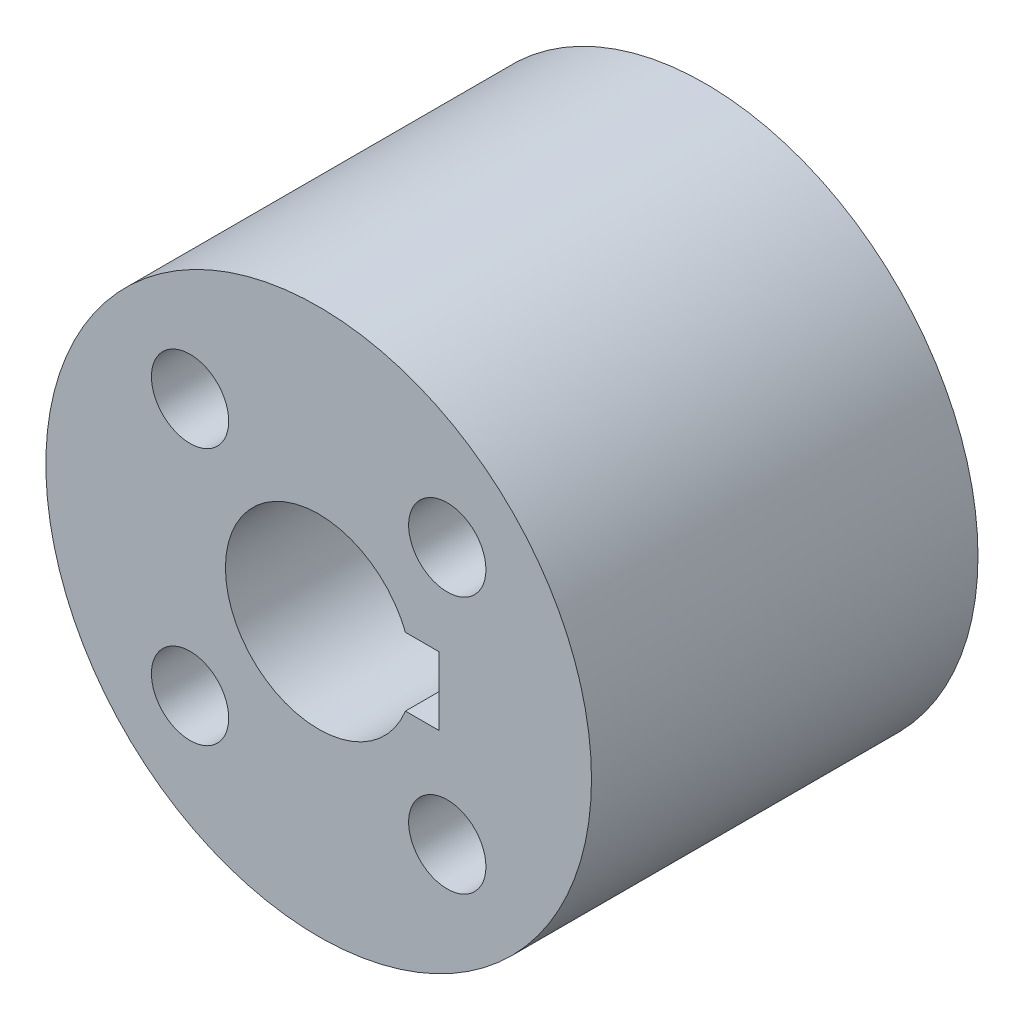
ISO-10303-21;
HEADER;
FILE_DESCRIPTION(('STEP AP214'),'2;1');
FILE_NAME('part.step','',(''),(''),'','','');
FILE_SCHEMA(('AUTOMOTIVE_DESIGN { 1 0 10303 214 1 1 1 1 }'));
ENDSEC;
DATA;
#1=APPLICATION_CONTEXT('core data for automotive mechanical design processes');
#2=APPLICATION_PROTOCOL_DEFINITION('international standard','automotive_design',2000,#1);
#3=PRODUCT_CONTEXT('',#1,'mechanical');
#4=PRODUCT('Part','Part','',(#3));
#5=PRODUCT_RELATED_PRODUCT_CATEGORY('part','',(#4));
#6=PRODUCT_DEFINITION_FORMATION('','',#4);
#7=PRODUCT_DEFINITION_CONTEXT('part definition',#1,'design');
#8=PRODUCT_DEFINITION('design','',#6,#7);
#9=PRODUCT_DEFINITION_SHAPE('','',#8);
#10=(LENGTH_UNIT() NAMED_UNIT(*) SI_UNIT(.MILLI.,.METRE.));
#11=(NAMED_UNIT(*) PLANE_ANGLE_UNIT() SI_UNIT($,.RADIAN.));
#12=(NAMED_UNIT(*) SI_UNIT($,.STERADIAN.) SOLID_ANGLE_UNIT());
#13=UNCERTAINTY_MEASURE_WITH_UNIT(LENGTH_MEASURE(1.E-05),#10,'distance_accuracy_value','');
#14=(GEOMETRIC_REPRESENTATION_CONTEXT(3) GLOBAL_UNCERTAINTY_ASSIGNED_CONTEXT((#13)) GLOBAL_UNIT_ASSIGNED_CONTEXT((#10,
#11,#12)) REPRESENTATION_CONTEXT('',''));
#15=CARTESIAN_POINT('',(0.,0.,0.));
#16=DIRECTION('',(0.,0.,1.));
#17=DIRECTION('',(1.,0.,0.));
#18=AXIS2_PLACEMENT_3D('',#15,#16,#17);
#19=CARTESIAN_POINT('',(5.65685424949237,-5.65685424949239,17.));
#20=DIRECTION('',(0.,0.,-1.));
#21=DIRECTION('',(-1.,0.,0.));
#22=AXIS2_PLACEMENT_3D('',#19,#20,#21);
#23=CYLINDRICAL_SURFACE('',#22,1.7);
#24=CARTESIAN_POINT('',(5.65685424949237,-5.65685424949239,12.));
#25=DIRECTION('',(0.,0.,1.));
#26=DIRECTION('',(1.,0.,0.));
#27=AXIS2_PLACEMENT_3D('',#24,#25,#26);
#28=CIRCLE('',#27,1.7);
#29=CARTESIAN_POINT('',(7.35685424949237,-5.65685424949239,12.));
#30=VERTEX_POINT('',#29);
#31=EDGE_CURVE('E182',#30,#30,#28,.T.);
#32=ORIENTED_EDGE('',*,*,#31,.F.);
#33=EDGE_LOOP('',(#32));
#34=FACE_BOUND('',#33,.T.);
#35=CARTESIAN_POINT('',(5.65685424949237,-5.65685424949239,17.));
#36=DIRECTION('',(0.,0.,1.));
#37=DIRECTION('',(1.,0.,0.));
#38=AXIS2_PLACEMENT_3D('',#35,#36,#37);
#39=CIRCLE('',#38,1.7);
#40=CARTESIAN_POINT('',(7.35685424949237,-5.65685424949239,17.));
#41=VERTEX_POINT('',#40);
#42=EDGE_CURVE('E282',#41,#41,#39,.T.);
#43=ORIENTED_EDGE('',*,*,#42,.T.);
#44=EDGE_LOOP('',(#43));
#45=FACE_BOUND('',#44,.T.);
#46=ADVANCED_FACE('F178',(#34,#45),#23,.F.);
#47=CARTESIAN_POINT('',(0.,0.,0.));
#48=DIRECTION('',(0.,0.,1.));
#49=DIRECTION('',(1.,0.,0.));
#50=AXIS2_PLACEMENT_3D('',#47,#48,#49);
#51=PLANE('',#50);
#52=CARTESIAN_POINT('',(5.65685424949245,-5.65685424949231,0.));
#53=DIRECTION('',(0.,0.,-1.));
#54=DIRECTION('',(-1.,0.,0.));
#55=AXIS2_PLACEMENT_3D('',#52,#53,#54);
#56=CIRCLE('',#55,3.5);
#57=CARTESIAN_POINT('',(2.15685424949245,-5.65685424949231,0.));
#58=VERTEX_POINT('',#57);
#59=EDGE_CURVE('E368',#58,#58,#56,.T.);
#60=ORIENTED_EDGE('',*,*,#59,.F.);
#61=EDGE_LOOP('',(#60));
#62=FACE_BOUND('',#61,.T.);
#63=CARTESIAN_POINT('',(-5.65685424949233,-5.65685424949243,0.));
#64=DIRECTION('',(0.,0.,-1.));
#65=DIRECTION('',(-1.,0.,0.));
#66=AXIS2_PLACEMENT_3D('',#63,#64,#65);
#67=CIRCLE('',#66,3.5);
#68=CARTESIAN_POINT('',(-9.15685424949233,-5.65685424949243,0.));
#69=VERTEX_POINT('',#68);
#70=EDGE_CURVE('E358',#69,#69,#67,.T.);
#71=ORIENTED_EDGE('',*,*,#70,.F.);
#72=EDGE_LOOP('',(#71));
#73=FACE_BOUND('',#72,.T.);
#74=CARTESIAN_POINT('',(-5.65685424949241,5.65685424949235,0.));
#75=DIRECTION('',(0.,0.,-1.));
#76=DIRECTION('',(-1.,0.,0.));
#77=AXIS2_PLACEMENT_3D('',#74,#75,#76);
#78=CIRCLE('',#77,3.5);
#79=CARTESIAN_POINT('',(-9.15685424949241,5.65685424949235,0.));
#80=VERTEX_POINT('',#79);
#81=EDGE_CURVE('E357',#80,#80,#78,.T.);
#82=ORIENTED_EDGE('',*,*,#81,.F.);
#83=EDGE_LOOP('',(#82));
#84=FACE_BOUND('',#83,.T.);
#85=CARTESIAN_POINT('',(5.65685424949237,5.65685424949239,0.));
#86=DIRECTION('',(0.,0.,-1.));
#87=DIRECTION('',(-1.,0.,0.));
#88=AXIS2_PLACEMENT_3D('',#85,#86,#87);
#89=CIRCLE('',#88,3.5);
#90=CARTESIAN_POINT('',(2.15685424949237,5.65685424949239,0.));
#91=VERTEX_POINT('',#90);
#92=EDGE_CURVE('E361',#91,#91,#89,.T.);
#93=ORIENTED_EDGE('',*,*,#92,.F.);
#94=EDGE_LOOP('',(#93));
#95=FACE_BOUND('',#94,.T.);
#96=CARTESIAN_POINT('',(0.,0.,0.));
#97=DIRECTION('',(0.,0.,1.));
#98=DIRECTION('',(1.,0.,0.));
#99=AXIS2_PLACEMENT_3D('',#96,#97,#98);
#100=CIRCLE('',#99,12.);
#101=CARTESIAN_POINT('',(12.,0.,0.));
#102=VERTEX_POINT('',#101);
#103=EDGE_CURVE('E245',#102,#102,#100,.T.);
#104=ORIENTED_EDGE('',*,*,#103,.F.);
#105=EDGE_LOOP('',(#104));
#106=FACE_BOUND('',#105,.T.);
#107=CARTESIAN_POINT('',(0.,0.,0.));
#108=DIRECTION('',(0.,0.,1.));
#109=DIRECTION('',(1.,0.,0.));
#110=AXIS2_PLACEMENT_3D('',#107,#108,#109);
#111=CIRCLE('',#110,4.1);
#112=CARTESIAN_POINT('',(3.81575680566778,1.5,0.));
#113=VERTEX_POINT('',#112);
#114=CARTESIAN_POINT('',(3.81575680566778,-1.5,0.));
#115=VERTEX_POINT('',#114);
#116=EDGE_CURVE('E248',#113,#115,#111,.T.);
#117=ORIENTED_EDGE('',*,*,#116,.T.);
#118=DIRECTION('',(1.,0.,0.));
#119=VECTOR('',#118,1.);
#120=CARTESIAN_POINT('',(0.,-1.5,0.));
#121=LINE('',#120,#119);
#122=CARTESIAN_POINT('',(5.3,-1.5,0.));
#123=VERTEX_POINT('',#122);
#124=EDGE_CURVE('E253',#115,#123,#121,.T.);
#125=ORIENTED_EDGE('',*,*,#124,.T.);
#126=DIRECTION('',(0.,1.,0.));
#127=VECTOR('',#126,1.);
#128=CARTESIAN_POINT('',(5.3,0.,0.));
#129=LINE('',#128,#127);
#130=CARTESIAN_POINT('',(5.3,1.5,0.));
#131=VERTEX_POINT('',#130);
#132=EDGE_CURVE('E251',#123,#131,#129,.T.);
#133=ORIENTED_EDGE('',*,*,#132,.T.);
#134=DIRECTION('',(1.,0.,0.));
#135=VECTOR('',#134,1.);
#136=CARTESIAN_POINT('',(0.,1.5,0.));
#137=LINE('',#136,#135);
#138=EDGE_CURVE('E235',#113,#131,#137,.T.);
#139=ORIENTED_EDGE('',*,*,#138,.F.);
#140=EDGE_LOOP('',(#117,#125,#133,#139));
#141=FACE_BOUND('',#140,.T.);
#142=ADVANCED_FACE('F277',(#62,#73,#84,#95,#106,#141),#51,.F.);
#143=CARTESIAN_POINT('',(-5.65685424949241,-5.65685424949235,17.));
#144=DIRECTION('',(0.,0.,-1.));
#145=DIRECTION('',(-1.,0.,0.));
#146=AXIS2_PLACEMENT_3D('',#143,#144,#145);
#147=CYLINDRICAL_SURFACE('',#146,1.7);
#148=CARTESIAN_POINT('',(-5.65685424949241,-5.65685424949235,12.));
#149=DIRECTION('',(0.,0.,1.));
#150=DIRECTION('',(1.,0.,0.));
#151=AXIS2_PLACEMENT_3D('',#148,#149,#150);
#152=CIRCLE('',#151,1.7);
#153=CARTESIAN_POINT('',(-3.95685424949241,-5.65685424949235,12.));
#154=VERTEX_POINT('',#153);
#155=EDGE_CURVE('E265',#154,#154,#152,.T.);
#156=ORIENTED_EDGE('',*,*,#155,.F.);
#157=EDGE_LOOP('',(#156));
#158=FACE_BOUND('',#157,.T.);
#159=CARTESIAN_POINT('',(-5.65685424949241,-5.65685424949235,17.));
#160=DIRECTION('',(0.,0.,1.));
#161=DIRECTION('',(1.,0.,0.));
#162=AXIS2_PLACEMENT_3D('',#159,#160,#161);
#163=CIRCLE('',#162,1.7);
#164=CARTESIAN_POINT('',(-3.95685424949241,-5.65685424949235,17.));
#165=VERTEX_POINT('',#164);
#166=EDGE_CURVE('E284',#165,#165,#163,.T.);
#167=ORIENTED_EDGE('',*,*,#166,.T.);
#168=EDGE_LOOP('',(#167));
#169=FACE_BOUND('',#168,.T.);
#170=ADVANCED_FACE('F279',(#158,#169),#147,.F.);
#171=CARTESIAN_POINT('',(-5.65685424949233,5.65685424949243,17.));
#172=DIRECTION('',(0.,0.,-1.));
#173=DIRECTION('',(-1.,0.,0.));
#174=AXIS2_PLACEMENT_3D('',#171,#172,#173);
#175=CYLINDRICAL_SURFACE('',#174,1.7);
#176=CARTESIAN_POINT('',(-5.65685424949233,5.65685424949243,12.));
#177=DIRECTION('',(0.,0.,1.));
#178=DIRECTION('',(1.,0.,0.));
#179=AXIS2_PLACEMENT_3D('',#176,#177,#178);
#180=CIRCLE('',#179,1.7);
#181=CARTESIAN_POINT('',(-3.95685424949233,5.65685424949243,12.));
#182=VERTEX_POINT('',#181);
#183=EDGE_CURVE('E262',#182,#182,#180,.T.);
#184=ORIENTED_EDGE('',*,*,#183,.F.);
#185=EDGE_LOOP('',(#184));
#186=FACE_BOUND('',#185,.T.);
#187=CARTESIAN_POINT('',(-5.65685424949233,5.65685424949243,17.));
#188=DIRECTION('',(0.,0.,1.));
#189=DIRECTION('',(1.,0.,0.));
#190=AXIS2_PLACEMENT_3D('',#187,#188,#189);
#191=CIRCLE('',#190,1.7);
#192=CARTESIAN_POINT('',(-3.95685424949233,5.65685424949243,17.));
#193=VERTEX_POINT('',#192);
#194=EDGE_CURVE('E256',#193,#193,#191,.T.);
#195=ORIENTED_EDGE('',*,*,#194,.T.);
#196=EDGE_LOOP('',(#195));
#197=FACE_BOUND('',#196,.T.);
#198=ADVANCED_FACE('F180',(#186,#197),#175,.F.);
#199=CARTESIAN_POINT('',(5.65685424949237,5.65685424949239,17.));
#200=DIRECTION('',(0.,0.,-1.));
#201=DIRECTION('',(-1.,0.,0.));
#202=AXIS2_PLACEMENT_3D('',#199,#200,#201);
#203=CYLINDRICAL_SURFACE('',#202,1.7);
#204=CARTESIAN_POINT('',(5.65685424949237,5.65685424949239,12.));
#205=DIRECTION('',(0.,0.,1.));
#206=DIRECTION('',(1.,0.,0.));
#207=AXIS2_PLACEMENT_3D('',#204,#205,#206);
#208=CIRCLE('',#207,1.7);
#209=CARTESIAN_POINT('',(7.35685424949237,5.65685424949239,12.));
#210=VERTEX_POINT('',#209);
#211=EDGE_CURVE('E259',#210,#210,#208,.T.);
#212=ORIENTED_EDGE('',*,*,#211,.F.);
#213=EDGE_LOOP('',(#212));
#214=FACE_BOUND('',#213,.T.);
#215=CARTESIAN_POINT('',(5.65685424949237,5.65685424949239,17.));
#216=DIRECTION('',(0.,0.,1.));
#217=DIRECTION('',(1.,0.,0.));
#218=AXIS2_PLACEMENT_3D('',#215,#216,#217);
#219=CIRCLE('',#218,1.7);
#220=CARTESIAN_POINT('',(7.35685424949237,5.65685424949239,17.));
#221=VERTEX_POINT('',#220);
#222=EDGE_CURVE('E285',#221,#221,#219,.T.);
#223=ORIENTED_EDGE('',*,*,#222,.T.);
#224=EDGE_LOOP('',(#223));
#225=FACE_BOUND('',#224,.T.);
#226=ADVANCED_FACE('F304',(#214,#225),#203,.F.);
#227=CARTESIAN_POINT('',(5.3,0.,17.));
#228=DIRECTION('',(-1.,0.,0.));
#229=DIRECTION('',(0.,0.,1.));
#230=AXIS2_PLACEMENT_3D('',#227,#228,#229);
#231=PLANE('',#230);
#232=ORIENTED_EDGE('',*,*,#132,.F.);
#233=DIRECTION('',(0.,0.,-1.));
#234=VECTOR('',#233,1.);
#235=CARTESIAN_POINT('',(5.3,-1.5,17.));
#236=LINE('',#235,#234);
#237=CARTESIAN_POINT('',(5.3,-1.5,17.));
#238=VERTEX_POINT('',#237);
#239=EDGE_CURVE('E210',#238,#123,#236,.T.);
#240=ORIENTED_EDGE('',*,*,#239,.F.);
#241=DIRECTION('',(0.,1.,0.));
#242=VECTOR('',#241,1.);
#243=CARTESIAN_POINT('',(5.3,0.,17.));
#244=LINE('',#243,#242);
#245=CARTESIAN_POINT('',(5.3,1.5,17.));
#246=VERTEX_POINT('',#245);
#247=EDGE_CURVE('E228',#238,#246,#244,.T.);
#248=ORIENTED_EDGE('',*,*,#247,.T.);
#249=DIRECTION('',(0.,0.,-1.));
#250=VECTOR('',#249,1.);
#251=CARTESIAN_POINT('',(5.3,1.5,17.));
#252=LINE('',#251,#250);
#253=EDGE_CURVE('E188',#246,#131,#252,.T.);
#254=ORIENTED_EDGE('',*,*,#253,.T.);
#255=EDGE_LOOP('',(#232,#240,#248,#254));
#256=FACE_BOUND('',#255,.T.);
#257=ADVANCED_FACE('F239',(#256),#231,.T.);
#258=CARTESIAN_POINT('',(0.,-1.5,17.));
#259=DIRECTION('',(0.,1.,0.));
#260=DIRECTION('',(0.,0.,1.));
#261=AXIS2_PLACEMENT_3D('',#258,#259,#260);
#262=PLANE('',#261);
#263=ORIENTED_EDGE('',*,*,#124,.F.);
#264=DIRECTION('',(0.,0.,-1.));
#265=VECTOR('',#264,1.);
#266=CARTESIAN_POINT('',(3.81575680566778,-1.5,17.));
#267=LINE('',#266,#265);
#268=CARTESIAN_POINT('',(3.81575680566778,-1.5,17.));
#269=VERTEX_POINT('',#268);
#270=EDGE_CURVE('E197',#269,#115,#267,.T.);
#271=ORIENTED_EDGE('',*,*,#270,.F.);
#272=DIRECTION('',(1.,0.,0.));
#273=VECTOR('',#272,1.);
#274=CARTESIAN_POINT('',(0.,-1.5,17.));
#275=LINE('',#274,#273);
#276=EDGE_CURVE('E240',#269,#238,#275,.T.);
#277=ORIENTED_EDGE('',*,*,#276,.T.);
#278=ORIENTED_EDGE('',*,*,#239,.T.);
#279=EDGE_LOOP('',(#263,#271,#277,#278));
#280=FACE_BOUND('',#279,.T.);
#281=ADVANCED_FACE('F296',(#280),#262,.T.);
#282=CARTESIAN_POINT('',(0.,1.5,17.));
#283=DIRECTION('',(0.,1.,0.));
#284=DIRECTION('',(0.,0.,1.));
#285=AXIS2_PLACEMENT_3D('',#282,#283,#284);
#286=PLANE('',#285);
#287=ORIENTED_EDGE('',*,*,#138,.T.);
#288=ORIENTED_EDGE('',*,*,#253,.F.);
#289=DIRECTION('',(1.,0.,0.));
#290=VECTOR('',#289,1.);
#291=CARTESIAN_POINT('',(0.,1.5,17.));
#292=LINE('',#291,#290);
#293=CARTESIAN_POINT('',(3.81575680566778,1.5,17.));
#294=VERTEX_POINT('',#293);
#295=EDGE_CURVE('E223',#294,#246,#292,.T.);
#296=ORIENTED_EDGE('',*,*,#295,.F.);
#297=DIRECTION('',(0.,0.,-1.));
#298=VECTOR('',#297,1.);
#299=CARTESIAN_POINT('',(3.81575680566778,1.5,17.));
#300=LINE('',#299,#298);
#301=EDGE_CURVE('E13',#294,#113,#300,.T.);
#302=ORIENTED_EDGE('',*,*,#301,.T.);
#303=EDGE_LOOP('',(#287,#288,#296,#302));
#304=FACE_BOUND('',#303,.T.);
#305=ADVANCED_FACE('F233',(#304),#286,.F.);
#306=CARTESIAN_POINT('',(0.,0.,17.));
#307=DIRECTION('',(0.,0.,-1.));
#308=DIRECTION('',(-1.,0.,0.));
#309=AXIS2_PLACEMENT_3D('',#306,#307,#308);
#310=CYLINDRICAL_SURFACE('',#309,4.1);
#311=ORIENTED_EDGE('',*,*,#116,.F.);
#312=ORIENTED_EDGE('',*,*,#301,.F.);
#313=CARTESIAN_POINT('',(0.,0.,17.));
#314=DIRECTION('',(0.,0.,1.));
#315=DIRECTION('',(1.,0.,0.));
#316=AXIS2_PLACEMENT_3D('',#313,#314,#315);
#317=CIRCLE('',#316,4.1);
#318=EDGE_CURVE('E229',#294,#269,#317,.T.);
#319=ORIENTED_EDGE('',*,*,#318,.T.);
#320=ORIENTED_EDGE('',*,*,#270,.T.);
#321=EDGE_LOOP('',(#311,#312,#319,#320));
#322=FACE_BOUND('',#321,.T.);
#323=ADVANCED_FACE('F295',(#322),#310,.F.);
#324=CARTESIAN_POINT('',(0.,0.,17.));
#325=DIRECTION('',(0.,0.,-1.));
#326=DIRECTION('',(-1.,0.,0.));
#327=AXIS2_PLACEMENT_3D('',#324,#325,#326);
#328=CYLINDRICAL_SURFACE('',#327,12.);
#329=CARTESIAN_POINT('',(0.,0.,17.));
#330=DIRECTION('',(0.,0.,1.));
#331=DIRECTION('',(1.,0.,0.));
#332=AXIS2_PLACEMENT_3D('',#329,#330,#331);
#333=CIRCLE('',#332,12.);
#334=CARTESIAN_POINT('',(12.,0.,17.));
#335=VERTEX_POINT('',#334);
#336=EDGE_CURVE('E288',#335,#335,#333,.T.);
#337=ORIENTED_EDGE('',*,*,#336,.F.);
#338=EDGE_LOOP('',(#337));
#339=FACE_BOUND('',#338,.T.);
#340=ORIENTED_EDGE('',*,*,#103,.T.);
#341=EDGE_LOOP('',(#340));
#342=FACE_BOUND('',#341,.T.);
#343=ADVANCED_FACE('F320',(#339,#342),#328,.T.);
#344=CARTESIAN_POINT('',(0.,0.,17.));
#345=DIRECTION('',(0.,0.,1.));
#346=DIRECTION('',(1.,0.,0.));
#347=AXIS2_PLACEMENT_3D('',#344,#345,#346);
#348=PLANE('',#347);
#349=ORIENTED_EDGE('',*,*,#194,.F.);
#350=EDGE_LOOP('',(#349));
#351=FACE_BOUND('',#350,.T.);
#352=ORIENTED_EDGE('',*,*,#222,.F.);
#353=EDGE_LOOP('',(#352));
#354=FACE_BOUND('',#353,.T.);
#355=ORIENTED_EDGE('',*,*,#42,.F.);
#356=EDGE_LOOP('',(#355));
#357=FACE_BOUND('',#356,.T.);
#358=ORIENTED_EDGE('',*,*,#166,.F.);
#359=EDGE_LOOP('',(#358));
#360=FACE_BOUND('',#359,.T.);
#361=ORIENTED_EDGE('',*,*,#336,.T.);
#362=EDGE_LOOP('',(#361));
#363=FACE_BOUND('',#362,.T.);
#364=ORIENTED_EDGE('',*,*,#318,.F.);
#365=ORIENTED_EDGE('',*,*,#295,.T.);
#366=ORIENTED_EDGE('',*,*,#247,.F.);
#367=ORIENTED_EDGE('',*,*,#276,.F.);
#368=EDGE_LOOP('',(#364,#365,#366,#367));
#369=FACE_BOUND('',#368,.T.);
#370=ADVANCED_FACE('F225',(#351,#354,#357,#360,#363,#369),#348,.T.);
#371=CARTESIAN_POINT('',(0.,0.,12.));
#372=DIRECTION('',(0.,0.,1.));
#373=DIRECTION('',(1.,0.,0.));
#374=AXIS2_PLACEMENT_3D('',#371,#372,#373);
#375=PLANE('',#374);
#376=ORIENTED_EDGE('',*,*,#211,.T.);
#377=EDGE_LOOP('',(#376));
#378=FACE_BOUND('',#377,.T.);
#379=CARTESIAN_POINT('',(5.65685424949237,5.65685424949239,12.));
#380=DIRECTION('',(0.,0.,1.));
#381=DIRECTION('',(1.,0.,0.));
#382=AXIS2_PLACEMENT_3D('',#379,#380,#381);
#383=CIRCLE('',#382,3.5);
#384=CARTESIAN_POINT('',(2.15685424949237,5.65685424949239,12.));
#385=VERTEX_POINT('',#384);
#386=EDGE_CURVE('E263',#385,#385,#383,.F.);
#387=ORIENTED_EDGE('',*,*,#386,.T.);
#388=EDGE_LOOP('',(#387));
#389=FACE_BOUND('',#388,.T.);
#390=ADVANCED_FACE('F319',(#378,#389),#375,.F.);
#391=CARTESIAN_POINT('',(5.65685424949237,5.65685424949239,26.8994949366117));
#392=DIRECTION('',(0.,0.,-1.));
#393=DIRECTION('',(-1.,0.,0.));
#394=AXIS2_PLACEMENT_3D('',#391,#392,#393);
#395=CYLINDRICAL_SURFACE('',#394,3.5);
#396=CARTESIAN_POINT('',(2.15685424949237,5.65685424949239,0.));
#397=CARTESIAN_POINT('',(2.15685424949237,5.65685424949239,0.125000000000004));
#398=CARTESIAN_POINT('',(2.15685424949237,5.65685424949239,0.250000000000004));
#399=CARTESIAN_POINT('',(2.15685424949237,5.65685424949239,0.500000000000004));
#400=CARTESIAN_POINT('',(2.15685424949237,5.65685424949239,0.625000000000004));
#401=CARTESIAN_POINT('',(2.15685424949237,5.65685424949239,0.875000000000004));
#402=CARTESIAN_POINT('',(2.15685424949237,5.65685424949239,1.));
#403=CARTESIAN_POINT('',(2.15685424949237,5.65685424949239,1.25));
#404=CARTESIAN_POINT('',(2.15685424949237,5.65685424949239,1.375));
#405=CARTESIAN_POINT('',(2.15685424949237,5.65685424949239,1.625));
#406=CARTESIAN_POINT('',(2.15685424949237,5.65685424949239,1.75));
#407=CARTESIAN_POINT('',(2.15685424949237,5.65685424949239,2.));
#408=CARTESIAN_POINT('',(2.15685424949237,5.65685424949239,2.125));
#409=CARTESIAN_POINT('',(2.15685424949237,5.65685424949239,2.375));
#410=CARTESIAN_POINT('',(2.15685424949237,5.65685424949239,2.5));
#411=CARTESIAN_POINT('',(2.15685424949237,5.65685424949239,2.75));
#412=CARTESIAN_POINT('',(2.15685424949237,5.65685424949239,2.875));
#413=CARTESIAN_POINT('',(2.15685424949237,5.65685424949239,3.125));
#414=CARTESIAN_POINT('',(2.15685424949237,5.65685424949239,3.25));
#415=CARTESIAN_POINT('',(2.15685424949237,5.65685424949239,3.5));
#416=CARTESIAN_POINT('',(2.15685424949237,5.65685424949239,3.625));
#417=CARTESIAN_POINT('',(2.15685424949237,5.65685424949239,3.875));
#418=CARTESIAN_POINT('',(2.15685424949237,5.65685424949239,4.));
#419=CARTESIAN_POINT('',(2.15685424949237,5.65685424949239,4.25));
#420=CARTESIAN_POINT('',(2.15685424949237,5.65685424949239,4.375));
#421=CARTESIAN_POINT('',(2.15685424949237,5.65685424949239,4.625));
#422=CARTESIAN_POINT('',(2.15685424949237,5.65685424949239,4.75));
#423=CARTESIAN_POINT('',(2.15685424949237,5.65685424949239,5.));
#424=CARTESIAN_POINT('',(2.15685424949237,5.65685424949239,5.125));
#425=CARTESIAN_POINT('',(2.15685424949237,5.65685424949239,5.375));
#426=CARTESIAN_POINT('',(2.15685424949237,5.65685424949239,5.5));
#427=CARTESIAN_POINT('',(2.15685424949237,5.65685424949239,5.75));
#428=CARTESIAN_POINT('',(2.15685424949237,5.65685424949239,5.875));
#429=CARTESIAN_POINT('',(2.15685424949237,5.65685424949239,6.125));
#430=CARTESIAN_POINT('',(2.15685424949237,5.65685424949239,6.25));
#431=CARTESIAN_POINT('',(2.15685424949237,5.65685424949239,6.5));
#432=CARTESIAN_POINT('',(2.15685424949237,5.65685424949239,6.625));
#433=CARTESIAN_POINT('',(2.15685424949237,5.65685424949239,6.875));
#434=CARTESIAN_POINT('',(2.15685424949237,5.65685424949239,7.));
#435=CARTESIAN_POINT('',(2.15685424949237,5.65685424949239,7.25));
#436=CARTESIAN_POINT('',(2.15685424949237,5.65685424949239,7.375));
#437=CARTESIAN_POINT('',(2.15685424949237,5.65685424949239,7.625));
#438=CARTESIAN_POINT('',(2.15685424949237,5.65685424949239,7.75));
#439=CARTESIAN_POINT('',(2.15685424949237,5.65685424949239,8.));
#440=CARTESIAN_POINT('',(2.15685424949237,5.65685424949239,8.125));
#441=CARTESIAN_POINT('',(2.15685424949237,5.65685424949239,8.375));
#442=CARTESIAN_POINT('',(2.15685424949237,5.65685424949239,8.5));
#443=CARTESIAN_POINT('',(2.15685424949237,5.65685424949239,8.75));
#444=CARTESIAN_POINT('',(2.15685424949237,5.65685424949239,8.875));
#445=CARTESIAN_POINT('',(2.15685424949237,5.65685424949239,9.125));
#446=CARTESIAN_POINT('',(2.15685424949237,5.65685424949239,9.25));
#447=CARTESIAN_POINT('',(2.15685424949237,5.65685424949239,9.5));
#448=CARTESIAN_POINT('',(2.15685424949237,5.65685424949239,9.625));
#449=CARTESIAN_POINT('',(2.15685424949237,5.65685424949239,9.875));
#450=CARTESIAN_POINT('',(2.15685424949237,5.65685424949239,10.));
#451=CARTESIAN_POINT('',(2.15685424949237,5.65685424949239,10.25));
#452=CARTESIAN_POINT('',(2.15685424949237,5.65685424949239,10.375));
#453=CARTESIAN_POINT('',(2.15685424949237,5.65685424949239,10.625));
#454=CARTESIAN_POINT('',(2.15685424949237,5.65685424949239,10.75));
#455=CARTESIAN_POINT('',(2.15685424949237,5.65685424949239,11.));
#456=CARTESIAN_POINT('',(2.15685424949237,5.65685424949239,11.125));
#457=CARTESIAN_POINT('',(2.15685424949237,5.65685424949239,11.375));
#458=CARTESIAN_POINT('',(2.15685424949237,5.65685424949239,11.5));
#459=CARTESIAN_POINT('',(2.15685424949237,5.65685424949239,11.75));
#460=CARTESIAN_POINT('',(2.15685424949237,5.65685424949239,11.875));
#461=CARTESIAN_POINT('',(2.15685424949237,5.65685424949239,12.));
#462=B_SPLINE_CURVE_WITH_KNOTS('',3,(#396,#397,#398,#399,#400,#401,#402,#403,#404,#405,#406,
#407,#408,#409,#410,#411,#412,#413,#414,#415,#416,#417,#418,#419,#420,#421,#422,#423,#424,#425,
#426,#427,#428,#429,#430,#431,#432,#433,#434,#435,#436,#437,#438,#439,#440,#441,#442,#443,#444,
#445,#446,#447,#448,#449,#450,#451,#452,#453,#454,#455,#456,#457,#458,#459,#460,#461),
.UNSPECIFIED.,.F.,.F.,(4,2,2,2,2,2,2,2,2,2,2,2,2,2,2,2,2,2,2,2,2,2,2,2,2,2,2,2,2,2,2,2,4),(0.,
0.375,0.750000000000001,1.125,1.5,1.875,2.25,2.625,3.,3.375,3.75,4.125,4.5,4.875,5.25,5.625,6.,
6.375,6.75,7.125,7.5,7.875,8.25,8.625,9.,9.375,9.75,10.125,10.5,10.875,11.25,11.625,12.),.UNSPECIFIED.);
#463=EDGE_CURVE('BSEAM324',#91,#385,#462,.T.);
#464=ORIENTED_EDGE('',*,*,#92,.T.);
#465=ORIENTED_EDGE('',*,*,#386,.F.);
#466=ORIENTED_EDGE('',*,*,#463,.T.);
#467=ORIENTED_EDGE('',*,*,#463,.F.);
#468=EDGE_LOOP('',(#464,#466,#465,#467));
#469=FACE_BOUND('',#468,.T.);
#470=ADVANCED_FACE('F324',(#469),#395,.F.);
#471=CARTESIAN_POINT('',(0.,0.,12.));
#472=DIRECTION('',(0.,0.,1.));
#473=DIRECTION('',(1.,0.,0.));
#474=AXIS2_PLACEMENT_3D('',#471,#472,#473);
#475=PLANE('',#474);
#476=ORIENTED_EDGE('',*,*,#183,.T.);
#477=EDGE_LOOP('',(#476));
#478=FACE_BOUND('',#477,.T.);
#479=CARTESIAN_POINT('',(-5.65685424949241,5.65685424949235,12.));
#480=DIRECTION('',(0.,0.,1.));
#481=DIRECTION('',(1.,0.,0.));
#482=AXIS2_PLACEMENT_3D('',#479,#480,#481);
#483=CIRCLE('',#482,3.5);
#484=CARTESIAN_POINT('',(-9.15685424949241,5.65685424949235,12.));
#485=VERTEX_POINT('',#484);
#486=EDGE_CURVE('E355',#485,#485,#483,.F.);
#487=ORIENTED_EDGE('',*,*,#486,.T.);
#488=EDGE_LOOP('',(#487));
#489=FACE_BOUND('',#488,.T.);
#490=ADVANCED_FACE('F328',(#478,#489),#475,.F.);
#491=CARTESIAN_POINT('',(-5.65685424949241,5.65685424949235,26.8994949366117));
#492=DIRECTION('',(0.,0.,-1.));
#493=DIRECTION('',(-1.,0.,0.));
#494=AXIS2_PLACEMENT_3D('',#491,#492,#493);
#495=CYLINDRICAL_SURFACE('',#494,3.5);
#496=CARTESIAN_POINT('',(-9.15685424949241,5.65685424949235,0.));
#497=CARTESIAN_POINT('',(-9.15685424949241,5.65685424949235,0.125000000000004));
#498=CARTESIAN_POINT('',(-9.15685424949241,5.65685424949235,0.250000000000004));
#499=CARTESIAN_POINT('',(-9.15685424949241,5.65685424949235,0.500000000000004));
#500=CARTESIAN_POINT('',(-9.15685424949241,5.65685424949235,0.625000000000004));
#501=CARTESIAN_POINT('',(-9.15685424949241,5.65685424949235,0.875000000000004));
#502=CARTESIAN_POINT('',(-9.15685424949241,5.65685424949235,1.));
#503=CARTESIAN_POINT('',(-9.15685424949241,5.65685424949235,1.25));
#504=CARTESIAN_POINT('',(-9.15685424949241,5.65685424949235,1.375));
#505=CARTESIAN_POINT('',(-9.15685424949241,5.65685424949235,1.625));
#506=CARTESIAN_POINT('',(-9.15685424949241,5.65685424949235,1.75));
#507=CARTESIAN_POINT('',(-9.15685424949241,5.65685424949235,2.));
#508=CARTESIAN_POINT('',(-9.15685424949241,5.65685424949235,2.125));
#509=CARTESIAN_POINT('',(-9.15685424949241,5.65685424949235,2.375));
#510=CARTESIAN_POINT('',(-9.15685424949241,5.65685424949235,2.5));
#511=CARTESIAN_POINT('',(-9.15685424949241,5.65685424949235,2.75));
#512=CARTESIAN_POINT('',(-9.15685424949241,5.65685424949235,2.875));
#513=CARTESIAN_POINT('',(-9.15685424949241,5.65685424949235,3.125));
#514=CARTESIAN_POINT('',(-9.15685424949241,5.65685424949235,3.25));
#515=CARTESIAN_POINT('',(-9.15685424949241,5.65685424949235,3.5));
#516=CARTESIAN_POINT('',(-9.15685424949241,5.65685424949235,3.625));
#517=CARTESIAN_POINT('',(-9.15685424949241,5.65685424949235,3.875));
#518=CARTESIAN_POINT('',(-9.15685424949241,5.65685424949235,4.));
#519=CARTESIAN_POINT('',(-9.15685424949241,5.65685424949235,4.25));
#520=CARTESIAN_POINT('',(-9.15685424949241,5.65685424949235,4.375));
#521=CARTESIAN_POINT('',(-9.15685424949241,5.65685424949235,4.625));
#522=CARTESIAN_POINT('',(-9.15685424949241,5.65685424949235,4.75));
#523=CARTESIAN_POINT('',(-9.15685424949241,5.65685424949235,5.));
#524=CARTESIAN_POINT('',(-9.15685424949241,5.65685424949235,5.125));
#525=CARTESIAN_POINT('',(-9.15685424949241,5.65685424949235,5.375));
#526=CARTESIAN_POINT('',(-9.15685424949241,5.65685424949235,5.5));
#527=CARTESIAN_POINT('',(-9.15685424949241,5.65685424949235,5.75));
#528=CARTESIAN_POINT('',(-9.15685424949241,5.65685424949235,5.875));
#529=CARTESIAN_POINT('',(-9.15685424949241,5.65685424949235,6.125));
#530=CARTESIAN_POINT('',(-9.15685424949241,5.65685424949235,6.25));
#531=CARTESIAN_POINT('',(-9.15685424949241,5.65685424949235,6.5));
#532=CARTESIAN_POINT('',(-9.15685424949241,5.65685424949235,6.625));
#533=CARTESIAN_POINT('',(-9.15685424949241,5.65685424949235,6.875));
#534=CARTESIAN_POINT('',(-9.15685424949241,5.65685424949235,7.));
#535=CARTESIAN_POINT('',(-9.15685424949241,5.65685424949235,7.25));
#536=CARTESIAN_POINT('',(-9.15685424949241,5.65685424949235,7.375));
#537=CARTESIAN_POINT('',(-9.15685424949241,5.65685424949235,7.625));
#538=CARTESIAN_POINT('',(-9.15685424949241,5.65685424949235,7.75));
#539=CARTESIAN_POINT('',(-9.15685424949241,5.65685424949235,8.));
#540=CARTESIAN_POINT('',(-9.15685424949241,5.65685424949235,8.125));
#541=CARTESIAN_POINT('',(-9.15685424949241,5.65685424949235,8.375));
#542=CARTESIAN_POINT('',(-9.15685424949241,5.65685424949235,8.5));
#543=CARTESIAN_POINT('',(-9.15685424949241,5.65685424949235,8.75));
#544=CARTESIAN_POINT('',(-9.15685424949241,5.65685424949235,8.875));
#545=CARTESIAN_POINT('',(-9.15685424949241,5.65685424949235,9.125));
#546=CARTESIAN_POINT('',(-9.15685424949241,5.65685424949235,9.25));
#547=CARTESIAN_POINT('',(-9.15685424949241,5.65685424949235,9.5));
#548=CARTESIAN_POINT('',(-9.15685424949241,5.65685424949235,9.625));
#549=CARTESIAN_POINT('',(-9.15685424949241,5.65685424949235,9.875));
#550=CARTESIAN_POINT('',(-9.15685424949241,5.65685424949235,10.));
#551=CARTESIAN_POINT('',(-9.15685424949241,5.65685424949235,10.25));
#552=CARTESIAN_POINT('',(-9.15685424949241,5.65685424949235,10.375));
#553=CARTESIAN_POINT('',(-9.15685424949241,5.65685424949235,10.625));
#554=CARTESIAN_POINT('',(-9.15685424949241,5.65685424949235,10.75));
#555=CARTESIAN_POINT('',(-9.15685424949241,5.65685424949235,11.));
#556=CARTESIAN_POINT('',(-9.15685424949241,5.65685424949235,11.125));
#557=CARTESIAN_POINT('',(-9.15685424949241,5.65685424949235,11.375));
#558=CARTESIAN_POINT('',(-9.15685424949241,5.65685424949235,11.5));
#559=CARTESIAN_POINT('',(-9.15685424949241,5.65685424949235,11.75));
#560=CARTESIAN_POINT('',(-9.15685424949241,5.65685424949235,11.875));
#561=CARTESIAN_POINT('',(-9.15685424949241,5.65685424949235,12.));
#562=B_SPLINE_CURVE_WITH_KNOTS('',3,(#496,#497,#498,#499,#500,#501,#502,#503,#504,#505,#506,
#507,#508,#509,#510,#511,#512,#513,#514,#515,#516,#517,#518,#519,#520,#521,#522,#523,#524,#525,
#526,#527,#528,#529,#530,#531,#532,#533,#534,#535,#536,#537,#538,#539,#540,#541,#542,#543,#544,
#545,#546,#547,#548,#549,#550,#551,#552,#553,#554,#555,#556,#557,#558,#559,#560,#561),
.UNSPECIFIED.,.F.,.F.,(4,2,2,2,2,2,2,2,2,2,2,2,2,2,2,2,2,2,2,2,2,2,2,2,2,2,2,2,2,2,2,2,4),(0.,
0.375,0.750000000000001,1.125,1.5,1.875,2.25,2.625,3.,3.375,3.75,4.125,4.5,4.875,5.25,5.625,6.,
6.375,6.75,7.125,7.5,7.875,8.25,8.625,9.,9.375,9.75,10.125,10.5,10.875,11.25,11.625,12.),.UNSPECIFIED.);
#563=EDGE_CURVE('BSEAM343',#80,#485,#562,.T.);
#564=ORIENTED_EDGE('',*,*,#81,.T.);
#565=ORIENTED_EDGE('',*,*,#486,.F.);
#566=ORIENTED_EDGE('',*,*,#563,.T.);
#567=ORIENTED_EDGE('',*,*,#563,.F.);
#568=EDGE_LOOP('',(#564,#566,#565,#567));
#569=FACE_BOUND('',#568,.T.);
#570=ADVANCED_FACE('F343',(#569),#495,.F.);
#571=CARTESIAN_POINT('',(0.,0.,12.));
#572=DIRECTION('',(0.,0.,1.));
#573=DIRECTION('',(1.,0.,0.));
#574=AXIS2_PLACEMENT_3D('',#571,#572,#573);
#575=PLANE('',#574);
#576=ORIENTED_EDGE('',*,*,#155,.T.);
#577=EDGE_LOOP('',(#576));
#578=FACE_BOUND('',#577,.T.);
#579=CARTESIAN_POINT('',(-5.65685424949233,-5.65685424949243,12.));
#580=DIRECTION('',(0.,0.,1.));
#581=DIRECTION('',(1.,0.,0.));
#582=AXIS2_PLACEMENT_3D('',#579,#580,#581);
#583=CIRCLE('',#582,3.5);
#584=CARTESIAN_POINT('',(-9.15685424949233,-5.65685424949243,12.));
#585=VERTEX_POINT('',#584);
#586=EDGE_CURVE('E364',#585,#585,#583,.F.);
#587=ORIENTED_EDGE('',*,*,#586,.T.);
#588=EDGE_LOOP('',(#587));
#589=FACE_BOUND('',#588,.T.);
#590=ADVANCED_FACE('F339',(#578,#589),#575,.F.);
#591=CARTESIAN_POINT('',(-5.65685424949233,-5.65685424949243,26.8994949366117));
#592=DIRECTION('',(0.,0.,-1.));
#593=DIRECTION('',(-1.,0.,0.));
#594=AXIS2_PLACEMENT_3D('',#591,#592,#593);
#595=CYLINDRICAL_SURFACE('',#594,3.5);
#596=CARTESIAN_POINT('',(-9.15685424949233,-5.65685424949243,0.));
#597=CARTESIAN_POINT('',(-9.15685424949233,-5.65685424949243,0.125000000000004));
#598=CARTESIAN_POINT('',(-9.15685424949233,-5.65685424949243,0.250000000000004));
#599=CARTESIAN_POINT('',(-9.15685424949233,-5.65685424949243,0.500000000000004));
#600=CARTESIAN_POINT('',(-9.15685424949233,-5.65685424949243,0.625000000000004));
#601=CARTESIAN_POINT('',(-9.15685424949233,-5.65685424949243,0.875000000000004));
#602=CARTESIAN_POINT('',(-9.15685424949233,-5.65685424949243,1.));
#603=CARTESIAN_POINT('',(-9.15685424949233,-5.65685424949243,1.25));
#604=CARTESIAN_POINT('',(-9.15685424949233,-5.65685424949243,1.375));
#605=CARTESIAN_POINT('',(-9.15685424949233,-5.65685424949243,1.625));
#606=CARTESIAN_POINT('',(-9.15685424949233,-5.65685424949243,1.75));
#607=CARTESIAN_POINT('',(-9.15685424949233,-5.65685424949243,2.));
#608=CARTESIAN_POINT('',(-9.15685424949233,-5.65685424949243,2.125));
#609=CARTESIAN_POINT('',(-9.15685424949233,-5.65685424949243,2.375));
#610=CARTESIAN_POINT('',(-9.15685424949233,-5.65685424949243,2.5));
#611=CARTESIAN_POINT('',(-9.15685424949233,-5.65685424949243,2.75));
#612=CARTESIAN_POINT('',(-9.15685424949233,-5.65685424949243,2.875));
#613=CARTESIAN_POINT('',(-9.15685424949233,-5.65685424949243,3.125));
#614=CARTESIAN_POINT('',(-9.15685424949233,-5.65685424949243,3.25));
#615=CARTESIAN_POINT('',(-9.15685424949233,-5.65685424949243,3.5));
#616=CARTESIAN_POINT('',(-9.15685424949233,-5.65685424949243,3.625));
#617=CARTESIAN_POINT('',(-9.15685424949233,-5.65685424949243,3.875));
#618=CARTESIAN_POINT('',(-9.15685424949233,-5.65685424949243,4.));
#619=CARTESIAN_POINT('',(-9.15685424949233,-5.65685424949243,4.25));
#620=CARTESIAN_POINT('',(-9.15685424949233,-5.65685424949243,4.375));
#621=CARTESIAN_POINT('',(-9.15685424949233,-5.65685424949243,4.625));
#622=CARTESIAN_POINT('',(-9.15685424949233,-5.65685424949243,4.75));
#623=CARTESIAN_POINT('',(-9.15685424949233,-5.65685424949243,5.));
#624=CARTESIAN_POINT('',(-9.15685424949233,-5.65685424949243,5.125));
#625=CARTESIAN_POINT('',(-9.15685424949233,-5.65685424949243,5.375));
#626=CARTESIAN_POINT('',(-9.15685424949233,-5.65685424949243,5.5));
#627=CARTESIAN_POINT('',(-9.15685424949233,-5.65685424949243,5.75));
#628=CARTESIAN_POINT('',(-9.15685424949233,-5.65685424949243,5.875));
#629=CARTESIAN_POINT('',(-9.15685424949233,-5.65685424949243,6.125));
#630=CARTESIAN_POINT('',(-9.15685424949233,-5.65685424949243,6.25));
#631=CARTESIAN_POINT('',(-9.15685424949233,-5.65685424949243,6.5));
#632=CARTESIAN_POINT('',(-9.15685424949233,-5.65685424949243,6.625));
#633=CARTESIAN_POINT('',(-9.15685424949233,-5.65685424949243,6.875));
#634=CARTESIAN_POINT('',(-9.15685424949233,-5.65685424949243,7.));
#635=CARTESIAN_POINT('',(-9.15685424949233,-5.65685424949243,7.25));
#636=CARTESIAN_POINT('',(-9.15685424949233,-5.65685424949243,7.375));
#637=CARTESIAN_POINT('',(-9.15685424949233,-5.65685424949243,7.625));
#638=CARTESIAN_POINT('',(-9.15685424949233,-5.65685424949243,7.75));
#639=CARTESIAN_POINT('',(-9.15685424949233,-5.65685424949243,8.));
#640=CARTESIAN_POINT('',(-9.15685424949233,-5.65685424949243,8.125));
#641=CARTESIAN_POINT('',(-9.15685424949233,-5.65685424949243,8.375));
#642=CARTESIAN_POINT('',(-9.15685424949233,-5.65685424949243,8.5));
#643=CARTESIAN_POINT('',(-9.15685424949233,-5.65685424949243,8.75));
#644=CARTESIAN_POINT('',(-9.15685424949233,-5.65685424949243,8.875));
#645=CARTESIAN_POINT('',(-9.15685424949233,-5.65685424949243,9.125));
#646=CARTESIAN_POINT('',(-9.15685424949233,-5.65685424949243,9.25));
#647=CARTESIAN_POINT('',(-9.15685424949233,-5.65685424949243,9.5));
#648=CARTESIAN_POINT('',(-9.15685424949233,-5.65685424949243,9.625));
#649=CARTESIAN_POINT('',(-9.15685424949233,-5.65685424949243,9.875));
#650=CARTESIAN_POINT('',(-9.15685424949233,-5.65685424949243,10.));
#651=CARTESIAN_POINT('',(-9.15685424949233,-5.65685424949243,10.25));
#652=CARTESIAN_POINT('',(-9.15685424949233,-5.65685424949243,10.375));
#653=CARTESIAN_POINT('',(-9.15685424949233,-5.65685424949243,10.625));
#654=CARTESIAN_POINT('',(-9.15685424949233,-5.65685424949243,10.75));
#655=CARTESIAN_POINT('',(-9.15685424949233,-5.65685424949243,11.));
#656=CARTESIAN_POINT('',(-9.15685424949233,-5.65685424949243,11.125));
#657=CARTESIAN_POINT('',(-9.15685424949233,-5.65685424949243,11.375));
#658=CARTESIAN_POINT('',(-9.15685424949233,-5.65685424949243,11.5));
#659=CARTESIAN_POINT('',(-9.15685424949233,-5.65685424949243,11.75));
#660=CARTESIAN_POINT('',(-9.15685424949233,-5.65685424949243,11.875));
#661=CARTESIAN_POINT('',(-9.15685424949233,-5.65685424949243,12.));
#662=B_SPLINE_CURVE_WITH_KNOTS('',3,(#596,#597,#598,#599,#600,#601,#602,#603,#604,#605,#606,
#607,#608,#609,#610,#611,#612,#613,#614,#615,#616,#617,#618,#619,#620,#621,#622,#623,#624,#625,
#626,#627,#628,#629,#630,#631,#632,#633,#634,#635,#636,#637,#638,#639,#640,#641,#642,#643,#644,
#645,#646,#647,#648,#649,#650,#651,#652,#653,#654,#655,#656,#657,#658,#659,#660,#661),
.UNSPECIFIED.,.F.,.F.,(4,2,2,2,2,2,2,2,2,2,2,2,2,2,2,2,2,2,2,2,2,2,2,2,2,2,2,2,2,2,2,2,4),(0.,
0.375,0.750000000000001,1.125,1.5,1.875,2.25,2.625,3.,3.375,3.75,4.125,4.5,4.875,5.25,5.625,6.,
6.375,6.75,7.125,7.5,7.875,8.25,8.625,9.,9.375,9.75,10.125,10.5,10.875,11.25,11.625,12.),.UNSPECIFIED.);
#663=EDGE_CURVE('BSEAM336',#69,#585,#662,.T.);
#664=ORIENTED_EDGE('',*,*,#70,.T.);
#665=ORIENTED_EDGE('',*,*,#586,.F.);
#666=ORIENTED_EDGE('',*,*,#663,.T.);
#667=ORIENTED_EDGE('',*,*,#663,.F.);
#668=EDGE_LOOP('',(#664,#666,#665,#667));
#669=FACE_BOUND('',#668,.T.);
#670=ADVANCED_FACE('F336',(#669),#595,.F.);
#671=CARTESIAN_POINT('',(0.,0.,12.));
#672=DIRECTION('',(0.,0.,1.));
#673=DIRECTION('',(1.,0.,0.));
#674=AXIS2_PLACEMENT_3D('',#671,#672,#673);
#675=PLANE('',#674);
#676=ORIENTED_EDGE('',*,*,#31,.T.);
#677=EDGE_LOOP('',(#676));
#678=FACE_BOUND('',#677,.T.);
#679=CARTESIAN_POINT('',(5.65685424949245,-5.65685424949231,12.));
#680=DIRECTION('',(0.,0.,1.));
#681=DIRECTION('',(1.,0.,0.));
#682=AXIS2_PLACEMENT_3D('',#679,#680,#681);
#683=CIRCLE('',#682,3.5);
#684=CARTESIAN_POINT('',(2.15685424949245,-5.65685424949231,12.));
#685=VERTEX_POINT('',#684);
#686=EDGE_CURVE('E370',#685,#685,#683,.F.);
#687=ORIENTED_EDGE('',*,*,#686,.T.);
#688=EDGE_LOOP('',(#687));
#689=FACE_BOUND('',#688,.T.);
#690=ADVANCED_FACE('F272',(#678,#689),#675,.F.);
#691=CARTESIAN_POINT('',(5.65685424949245,-5.65685424949231,26.8994949366117));
#692=DIRECTION('',(0.,0.,-1.));
#693=DIRECTION('',(-1.,0.,0.));
#694=AXIS2_PLACEMENT_3D('',#691,#692,#693);
#695=CYLINDRICAL_SURFACE('',#694,3.5);
#696=CARTESIAN_POINT('',(2.15685424949245,-5.65685424949231,0.));
#697=CARTESIAN_POINT('',(2.15685424949245,-5.65685424949231,0.125000000000004));
#698=CARTESIAN_POINT('',(2.15685424949245,-5.65685424949231,0.250000000000004));
#699=CARTESIAN_POINT('',(2.15685424949245,-5.65685424949231,0.500000000000004));
#700=CARTESIAN_POINT('',(2.15685424949245,-5.65685424949231,0.625000000000004));
#701=CARTESIAN_POINT('',(2.15685424949245,-5.65685424949231,0.875000000000004));
#702=CARTESIAN_POINT('',(2.15685424949245,-5.65685424949231,1.));
#703=CARTESIAN_POINT('',(2.15685424949245,-5.65685424949231,1.25));
#704=CARTESIAN_POINT('',(2.15685424949245,-5.65685424949231,1.375));
#705=CARTESIAN_POINT('',(2.15685424949245,-5.65685424949231,1.625));
#706=CARTESIAN_POINT('',(2.15685424949245,-5.65685424949231,1.75));
#707=CARTESIAN_POINT('',(2.15685424949245,-5.65685424949231,2.));
#708=CARTESIAN_POINT('',(2.15685424949245,-5.65685424949231,2.125));
#709=CARTESIAN_POINT('',(2.15685424949245,-5.65685424949231,2.375));
#710=CARTESIAN_POINT('',(2.15685424949245,-5.65685424949231,2.5));
#711=CARTESIAN_POINT('',(2.15685424949245,-5.65685424949231,2.75));
#712=CARTESIAN_POINT('',(2.15685424949245,-5.65685424949231,2.875));
#713=CARTESIAN_POINT('',(2.15685424949245,-5.65685424949231,3.125));
#714=CARTESIAN_POINT('',(2.15685424949245,-5.65685424949231,3.25));
#715=CARTESIAN_POINT('',(2.15685424949245,-5.65685424949231,3.5));
#716=CARTESIAN_POINT('',(2.15685424949245,-5.65685424949231,3.625));
#717=CARTESIAN_POINT('',(2.15685424949245,-5.65685424949231,3.875));
#718=CARTESIAN_POINT('',(2.15685424949245,-5.65685424949231,4.));
#719=CARTESIAN_POINT('',(2.15685424949245,-5.65685424949231,4.25));
#720=CARTESIAN_POINT('',(2.15685424949245,-5.65685424949231,4.375));
#721=CARTESIAN_POINT('',(2.15685424949245,-5.65685424949231,4.625));
#722=CARTESIAN_POINT('',(2.15685424949245,-5.65685424949231,4.75));
#723=CARTESIAN_POINT('',(2.15685424949245,-5.65685424949231,5.));
#724=CARTESIAN_POINT('',(2.15685424949245,-5.65685424949231,5.125));
#725=CARTESIAN_POINT('',(2.15685424949245,-5.65685424949231,5.375));
#726=CARTESIAN_POINT('',(2.15685424949245,-5.65685424949231,5.5));
#727=CARTESIAN_POINT('',(2.15685424949245,-5.65685424949231,5.75));
#728=CARTESIAN_POINT('',(2.15685424949245,-5.65685424949231,5.875));
#729=CARTESIAN_POINT('',(2.15685424949245,-5.65685424949231,6.125));
#730=CARTESIAN_POINT('',(2.15685424949245,-5.65685424949231,6.25));
#731=CARTESIAN_POINT('',(2.15685424949245,-5.65685424949231,6.5));
#732=CARTESIAN_POINT('',(2.15685424949245,-5.65685424949231,6.625));
#733=CARTESIAN_POINT('',(2.15685424949245,-5.65685424949231,6.875));
#734=CARTESIAN_POINT('',(2.15685424949245,-5.65685424949231,7.));
#735=CARTESIAN_POINT('',(2.15685424949245,-5.65685424949231,7.25));
#736=CARTESIAN_POINT('',(2.15685424949245,-5.65685424949231,7.375));
#737=CARTESIAN_POINT('',(2.15685424949245,-5.65685424949231,7.625));
#738=CARTESIAN_POINT('',(2.15685424949245,-5.65685424949231,7.75));
#739=CARTESIAN_POINT('',(2.15685424949245,-5.65685424949231,8.));
#740=CARTESIAN_POINT('',(2.15685424949245,-5.65685424949231,8.125));
#741=CARTESIAN_POINT('',(2.15685424949245,-5.65685424949231,8.375));
#742=CARTESIAN_POINT('',(2.15685424949245,-5.65685424949231,8.5));
#743=CARTESIAN_POINT('',(2.15685424949245,-5.65685424949231,8.75));
#744=CARTESIAN_POINT('',(2.15685424949245,-5.65685424949231,8.875));
#745=CARTESIAN_POINT('',(2.15685424949245,-5.65685424949231,9.125));
#746=CARTESIAN_POINT('',(2.15685424949245,-5.65685424949231,9.25));
#747=CARTESIAN_POINT('',(2.15685424949245,-5.65685424949231,9.5));
#748=CARTESIAN_POINT('',(2.15685424949245,-5.65685424949231,9.625));
#749=CARTESIAN_POINT('',(2.15685424949245,-5.65685424949231,9.875));
#750=CARTESIAN_POINT('',(2.15685424949245,-5.65685424949231,10.));
#751=CARTESIAN_POINT('',(2.15685424949245,-5.65685424949231,10.25));
#752=CARTESIAN_POINT('',(2.15685424949245,-5.65685424949231,10.375));
#753=CARTESIAN_POINT('',(2.15685424949245,-5.65685424949231,10.625));
#754=CARTESIAN_POINT('',(2.15685424949245,-5.65685424949231,10.75));
#755=CARTESIAN_POINT('',(2.15685424949245,-5.65685424949231,11.));
#756=CARTESIAN_POINT('',(2.15685424949245,-5.65685424949231,11.125));
#757=CARTESIAN_POINT('',(2.15685424949245,-5.65685424949231,11.375));
#758=CARTESIAN_POINT('',(2.15685424949245,-5.65685424949231,11.5));
#759=CARTESIAN_POINT('',(2.15685424949245,-5.65685424949231,11.75));
#760=CARTESIAN_POINT('',(2.15685424949245,-5.65685424949231,11.875));
#761=CARTESIAN_POINT('',(2.15685424949245,-5.65685424949231,12.));
#762=B_SPLINE_CURVE_WITH_KNOTS('',3,(#696,#697,#698,#699,#700,#701,#702,#703,#704,#705,#706,
#707,#708,#709,#710,#711,#712,#713,#714,#715,#716,#717,#718,#719,#720,#721,#722,#723,#724,#725,
#726,#727,#728,#729,#730,#731,#732,#733,#734,#735,#736,#737,#738,#739,#740,#741,#742,#743,#744,
#745,#746,#747,#748,#749,#750,#751,#752,#753,#754,#755,#756,#757,#758,#759,#760,#761),
.UNSPECIFIED.,.F.,.F.,(4,2,2,2,2,2,2,2,2,2,2,2,2,2,2,2,2,2,2,2,2,2,2,2,2,2,2,2,2,2,2,2,4),(0.,
0.375,0.750000000000001,1.125,1.5,1.875,2.25,2.625,3.,3.375,3.75,4.125,4.5,4.875,5.25,5.625,6.,
6.375,6.75,7.125,7.5,7.875,8.25,8.625,9.,9.375,9.75,10.125,10.5,10.875,11.25,11.625,12.),.UNSPECIFIED.);
#763=EDGE_CURVE('BSEAM330',#58,#685,#762,.T.);
#764=ORIENTED_EDGE('',*,*,#59,.T.);
#765=ORIENTED_EDGE('',*,*,#686,.F.);
#766=ORIENTED_EDGE('',*,*,#763,.T.);
#767=ORIENTED_EDGE('',*,*,#763,.F.);
#768=EDGE_LOOP('',(#764,#766,#765,#767));
#769=FACE_BOUND('',#768,.T.);
#770=ADVANCED_FACE('F330',(#769),#695,.F.);
#771=CLOSED_SHELL('',(#46,#142,#170,#198,#226,#257,#281,#305,#323,#343,#370,#390,#470,#490,#570,
#590,#670,#690,#770));
#772=MANIFOLD_SOLID_BREP('B2',#771);
#773=ADVANCED_BREP_SHAPE_REPRESENTATION('',(#18,#772),#14);
#774=SHAPE_DEFINITION_REPRESENTATION(#9,#773);
ENDSEC;
END-ISO-10303-21;
